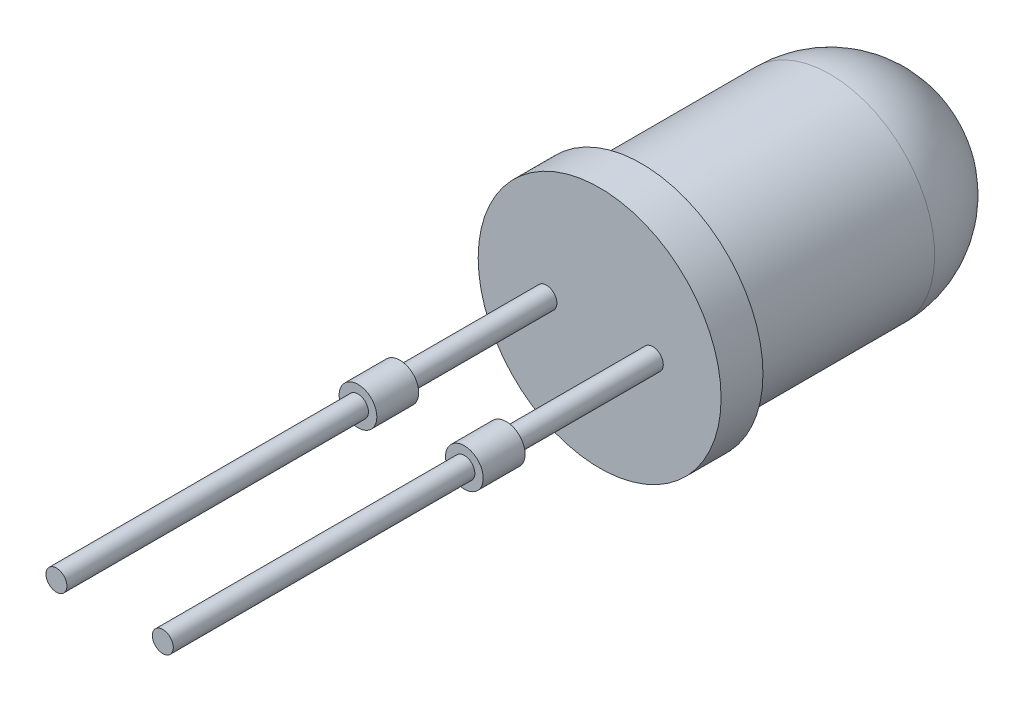
ISO-10303-21;
HEADER;
FILE_DESCRIPTION(('STEP AP214'),'2;1');
FILE_NAME('part.step','',(''),(''),'','','');
FILE_SCHEMA(('AUTOMOTIVE_DESIGN { 1 0 10303 214 1 1 1 1 }'));
ENDSEC;
DATA;
#1=APPLICATION_CONTEXT('core data for automotive mechanical design processes');
#2=APPLICATION_PROTOCOL_DEFINITION('international standard','automotive_design',2000,#1);
#3=PRODUCT_CONTEXT('',#1,'mechanical');
#4=PRODUCT('Part','Part','',(#3));
#5=PRODUCT_RELATED_PRODUCT_CATEGORY('part','',(#4));
#6=PRODUCT_DEFINITION_FORMATION('','',#4);
#7=PRODUCT_DEFINITION_CONTEXT('part definition',#1,'design');
#8=PRODUCT_DEFINITION('design','',#6,#7);
#9=PRODUCT_DEFINITION_SHAPE('','',#8);
#10=(LENGTH_UNIT() NAMED_UNIT(*) SI_UNIT(.MILLI.,.METRE.));
#11=(NAMED_UNIT(*) PLANE_ANGLE_UNIT() SI_UNIT($,.RADIAN.));
#12=(NAMED_UNIT(*) SI_UNIT($,.STERADIAN.) SOLID_ANGLE_UNIT());
#13=UNCERTAINTY_MEASURE_WITH_UNIT(LENGTH_MEASURE(1.E-05),#10,'distance_accuracy_value','');
#14=(GEOMETRIC_REPRESENTATION_CONTEXT(3) GLOBAL_UNCERTAINTY_ASSIGNED_CONTEXT((#13)) GLOBAL_UNIT_ASSIGNED_CONTEXT((#10,
#11,#12)) REPRESENTATION_CONTEXT('',''));
#15=CARTESIAN_POINT('',(0.,0.,0.));
#16=DIRECTION('',(0.,0.,1.));
#17=DIRECTION('',(1.,0.,0.));
#18=AXIS2_PLACEMENT_3D('',#15,#16,#17);
#19=CARTESIAN_POINT('',(0.,0.,5.5));
#20=DIRECTION('',(0.,0.,1.));
#21=DIRECTION('',(1.,0.,0.));
#22=AXIS2_PLACEMENT_3D('',#19,#20,#21);
#23=PLANE('',#22);
#24=CARTESIAN_POINT('',(0.,0.,5.5));
#25=DIRECTION('',(0.,0.,1.));
#26=DIRECTION('',(1.,0.,0.));
#27=AXIS2_PLACEMENT_3D('',#24,#25,#26);
#28=CIRCLE('',#27,2.9);
#29=CARTESIAN_POINT('',(2.9,0.,5.5));
#30=VERTEX_POINT('',#29);
#31=EDGE_CURVE('E51',#30,#30,#28,.T.);
#32=ORIENTED_EDGE('',*,*,#31,.T.);
#33=EDGE_LOOP('',(#32));
#34=FACE_BOUND('',#33,.T.);
#35=CARTESIAN_POINT('',(-1.27,0.,5.5));
#36=DIRECTION('',(0.,0.,1.));
#37=DIRECTION('',(1.,0.,0.));
#38=AXIS2_PLACEMENT_3D('',#35,#36,#37);
#39=CIRCLE('',#38,0.25);
#40=CARTESIAN_POINT('',(-1.02,0.,5.5));
#41=VERTEX_POINT('',#40);
#42=EDGE_CURVE('E73',#41,#41,#39,.T.);
#43=ORIENTED_EDGE('',*,*,#42,.F.);
#44=EDGE_LOOP('',(#43));
#45=FACE_BOUND('',#44,.T.);
#46=CARTESIAN_POINT('',(1.27,0.,5.5));
#47=DIRECTION('',(0.,0.,1.));
#48=DIRECTION('',(1.,0.,0.));
#49=AXIS2_PLACEMENT_3D('',#46,#47,#48);
#50=CIRCLE('',#49,0.25);
#51=CARTESIAN_POINT('',(1.52,0.,5.5));
#52=VERTEX_POINT('',#51);
#53=EDGE_CURVE('E82',#52,#52,#50,.T.);
#54=ORIENTED_EDGE('',*,*,#53,.F.);
#55=EDGE_LOOP('',(#54));
#56=FACE_BOUND('',#55,.T.);
#57=ADVANCED_FACE('F31',(#34,#45,#56),#23,.T.);
#58=CARTESIAN_POINT('',(0.,0.,5.5));
#59=DIRECTION('',(0.,0.,-1.));
#60=DIRECTION('',(-1.,0.,0.));
#61=AXIS2_PLACEMENT_3D('',#58,#59,#60);
#62=CYLINDRICAL_SURFACE('',#61,2.5);
#63=CARTESIAN_POINT('',(0.,0.,0.));
#64=DIRECTION('',(0.,0.,-1.));
#65=DIRECTION('',(-1.,0.,0.));
#66=AXIS2_PLACEMENT_3D('',#63,#64,#65);
#67=CIRCLE('',#66,2.5);
#68=CARTESIAN_POINT('',(-2.5,0.,0.));
#69=VERTEX_POINT('',#68);
#70=EDGE_CURVE('E60',#69,#69,#67,.T.);
#71=ORIENTED_EDGE('',*,*,#70,.F.);
#72=EDGE_LOOP('',(#71));
#73=FACE_BOUND('',#72,.T.);
#74=CARTESIAN_POINT('',(0.,0.,4.5));
#75=DIRECTION('',(0.,0.,1.));
#76=DIRECTION('',(1.,0.,0.));
#77=AXIS2_PLACEMENT_3D('',#74,#75,#76);
#78=CIRCLE('',#77,2.5);
#79=CARTESIAN_POINT('',(2.5,0.,4.5));
#80=VERTEX_POINT('',#79);
#81=EDGE_CURVE('E42',#80,#80,#78,.T.);
#82=ORIENTED_EDGE('',*,*,#81,.F.);
#83=EDGE_LOOP('',(#82));
#84=FACE_BOUND('',#83,.T.);
#85=ADVANCED_FACE('F33',(#73,#84),#62,.T.);
#86=CARTESIAN_POINT('',(0.,0.,4.5));
#87=DIRECTION('',(0.,0.,1.));
#88=DIRECTION('',(1.,0.,0.));
#89=AXIS2_PLACEMENT_3D('',#86,#87,#88);
#90=PLANE('',#89);
#91=CARTESIAN_POINT('',(0.,0.,4.5));
#92=DIRECTION('',(0.,0.,1.));
#93=DIRECTION('',(1.,0.,0.));
#94=AXIS2_PLACEMENT_3D('',#91,#92,#93);
#95=CIRCLE('',#94,2.9);
#96=CARTESIAN_POINT('',(2.9,0.,4.5));
#97=VERTEX_POINT('',#96);
#98=EDGE_CURVE('E46',#97,#97,#95,.T.);
#99=ORIENTED_EDGE('',*,*,#98,.F.);
#100=EDGE_LOOP('',(#99));
#101=FACE_BOUND('',#100,.T.);
#102=ORIENTED_EDGE('',*,*,#81,.T.);
#103=EDGE_LOOP('',(#102));
#104=FACE_BOUND('',#103,.T.);
#105=ADVANCED_FACE('F102',(#101,#104),#90,.F.);
#106=CARTESIAN_POINT('',(0.,0.,4.5));
#107=DIRECTION('',(0.,0.,1.));
#108=DIRECTION('',(1.,0.,0.));
#109=AXIS2_PLACEMENT_3D('',#106,#107,#108);
#110=CYLINDRICAL_SURFACE('',#109,2.9);
#111=ORIENTED_EDGE('',*,*,#98,.T.);
#112=EDGE_LOOP('',(#111));
#113=FACE_BOUND('',#112,.T.);
#114=ORIENTED_EDGE('',*,*,#31,.F.);
#115=EDGE_LOOP('',(#114));
#116=FACE_BOUND('',#115,.T.);
#117=ADVANCED_FACE('F106',(#113,#116),#110,.T.);
#118=CARTESIAN_POINT('',(0.,0.,0.));
#119=DIRECTION('',(0.,0.,-1.));
#120=DIRECTION('',(0.,1.,0.));
#121=AXIS2_PLACEMENT_3D('',#118,#119,#120);
#122=SPHERICAL_SURFACE('',#121,2.5);
#123=ORIENTED_EDGE('',*,*,#70,.T.);
#124=EDGE_LOOP('',(#123));
#125=FACE_BOUND('',#124,.T.);
#126=ADVANCED_FACE('F109',(#125),#122,.T.);
#127=CARTESIAN_POINT('',(-1.27,0.,9.));
#128=DIRECTION('',(0.,0.,1.));
#129=DIRECTION('',(1.,0.,0.));
#130=AXIS2_PLACEMENT_3D('',#127,#128,#129);
#131=PLANE('',#130);
#132=CARTESIAN_POINT('',(-1.27,0.,9.));
#133=DIRECTION('',(0.,0.,1.));
#134=DIRECTION('',(1.,0.,0.));
#135=AXIS2_PLACEMENT_3D('',#132,#133,#134);
#136=CIRCLE('',#135,0.45);
#137=CARTESIAN_POINT('',(-0.82,0.,9.));
#138=VERTEX_POINT('',#137);
#139=EDGE_CURVE('E69',#138,#138,#136,.T.);
#140=ORIENTED_EDGE('',*,*,#139,.F.);
#141=EDGE_LOOP('',(#140));
#142=FACE_BOUND('',#141,.T.);
#143=CARTESIAN_POINT('',(-1.27,0.,9.));
#144=DIRECTION('',(0.,0.,1.));
#145=DIRECTION('',(1.,0.,0.));
#146=AXIS2_PLACEMENT_3D('',#143,#144,#145);
#147=CIRCLE('',#146,0.25);
#148=CARTESIAN_POINT('',(-1.02,0.,9.));
#149=VERTEX_POINT('',#148);
#150=EDGE_CURVE('E72',#149,#149,#147,.T.);
#151=ORIENTED_EDGE('',*,*,#150,.T.);
#152=EDGE_LOOP('',(#151));
#153=FACE_BOUND('',#152,.T.);
#154=ADVANCED_FACE('F134',(#142,#153),#131,.F.);
#155=CARTESIAN_POINT('',(-1.27,0.,9.));
#156=DIRECTION('',(0.,0.,-1.));
#157=DIRECTION('',(-1.,0.,0.));
#158=AXIS2_PLACEMENT_3D('',#155,#156,#157);
#159=CYLINDRICAL_SURFACE('',#158,0.25);
#160=ORIENTED_EDGE('',*,*,#150,.F.);
#161=EDGE_LOOP('',(#160));
#162=FACE_BOUND('',#161,.T.);
#163=ORIENTED_EDGE('',*,*,#42,.T.);
#164=EDGE_LOOP('',(#163));
#165=FACE_BOUND('',#164,.T.);
#166=ADVANCED_FACE('F130',(#162,#165),#159,.T.);
#167=CARTESIAN_POINT('',(-1.27,0.,17.2));
#168=DIRECTION('',(0.,0.,1.));
#169=DIRECTION('',(1.,0.,0.));
#170=AXIS2_PLACEMENT_3D('',#167,#168,#169);
#171=PLANE('',#170);
#172=CARTESIAN_POINT('',(-1.27,0.,17.2));
#173=DIRECTION('',(0.,0.,-1.));
#174=DIRECTION('',(1.,0.,0.));
#175=AXIS2_PLACEMENT_3D('',#172,#173,#174);
#176=CIRCLE('',#175,0.25);
#177=CARTESIAN_POINT('',(-1.02,0.,17.2));
#178=VERTEX_POINT('',#177);
#179=EDGE_CURVE('E57',#178,#178,#176,.T.);
#180=ORIENTED_EDGE('',*,*,#179,.F.);
#181=EDGE_LOOP('',(#180));
#182=FACE_BOUND('',#181,.T.);
#183=ADVANCED_FACE('F126',(#182),#171,.T.);
#184=CARTESIAN_POINT('',(-1.27,0.,17.2));
#185=DIRECTION('',(0.,0.,-1.));
#186=DIRECTION('',(-1.,0.,0.));
#187=AXIS2_PLACEMENT_3D('',#184,#185,#186);
#188=CYLINDRICAL_SURFACE('',#187,0.25);
#189=CARTESIAN_POINT('',(-1.27,0.,10.));
#190=DIRECTION('',(0.,0.,1.));
#191=DIRECTION('',(1.,0.,0.));
#192=AXIS2_PLACEMENT_3D('',#189,#190,#191);
#193=CIRCLE('',#192,0.25);
#194=CARTESIAN_POINT('',(-1.02,0.,10.));
#195=VERTEX_POINT('',#194);
#196=EDGE_CURVE('E38',#195,#195,#193,.F.);
#197=ORIENTED_EDGE('',*,*,#196,.F.);
#198=EDGE_LOOP('',(#197));
#199=FACE_BOUND('',#198,.T.);
#200=ORIENTED_EDGE('',*,*,#179,.T.);
#201=EDGE_LOOP('',(#200));
#202=FACE_BOUND('',#201,.T.);
#203=ADVANCED_FACE('F122',(#199,#202),#188,.T.);
#204=CARTESIAN_POINT('',(-1.27,0.,10.));
#205=DIRECTION('',(0.,0.,1.));
#206=DIRECTION('',(1.,0.,0.));
#207=AXIS2_PLACEMENT_3D('',#204,#205,#206);
#208=PLANE('',#207);
#209=CARTESIAN_POINT('',(-1.27,0.,10.));
#210=DIRECTION('',(0.,0.,1.));
#211=DIRECTION('',(1.,0.,0.));
#212=AXIS2_PLACEMENT_3D('',#209,#210,#211);
#213=CIRCLE('',#212,0.45);
#214=CARTESIAN_POINT('',(-0.82,0.,10.));
#215=VERTEX_POINT('',#214);
#216=EDGE_CURVE('E63',#215,#215,#213,.T.);
#217=ORIENTED_EDGE('',*,*,#216,.T.);
#218=EDGE_LOOP('',(#217));
#219=FACE_BOUND('',#218,.T.);
#220=ORIENTED_EDGE('',*,*,#196,.T.);
#221=EDGE_LOOP('',(#220));
#222=FACE_BOUND('',#221,.T.);
#223=ADVANCED_FACE('F125',(#219,#222),#208,.T.);
#224=CARTESIAN_POINT('',(-1.27,0.,10.));
#225=DIRECTION('',(0.,0.,-1.));
#226=DIRECTION('',(-1.,0.,0.));
#227=AXIS2_PLACEMENT_3D('',#224,#225,#226);
#228=CYLINDRICAL_SURFACE('',#227,0.45);
#229=ORIENTED_EDGE('',*,*,#139,.T.);
#230=EDGE_LOOP('',(#229));
#231=FACE_BOUND('',#230,.T.);
#232=ORIENTED_EDGE('',*,*,#216,.F.);
#233=EDGE_LOOP('',(#232));
#234=FACE_BOUND('',#233,.T.);
#235=ADVANCED_FACE('F136',(#231,#234),#228,.T.);
#236=CARTESIAN_POINT('',(1.27,0.,9.));
#237=DIRECTION('',(0.,0.,1.));
#238=DIRECTION('',(1.,0.,0.));
#239=AXIS2_PLACEMENT_3D('',#236,#237,#238);
#240=PLANE('',#239);
#241=CARTESIAN_POINT('',(1.27,0.,9.));
#242=DIRECTION('',(0.,0.,1.));
#243=DIRECTION('',(1.,0.,0.));
#244=AXIS2_PLACEMENT_3D('',#241,#242,#243);
#245=CIRCLE('',#244,0.45);
#246=CARTESIAN_POINT('',(1.72,0.,9.));
#247=VERTEX_POINT('',#246);
#248=EDGE_CURVE('E76',#247,#247,#245,.T.);
#249=ORIENTED_EDGE('',*,*,#248,.F.);
#250=EDGE_LOOP('',(#249));
#251=FACE_BOUND('',#250,.T.);
#252=CARTESIAN_POINT('',(1.27,0.,9.));
#253=DIRECTION('',(0.,0.,1.));
#254=DIRECTION('',(1.,0.,0.));
#255=AXIS2_PLACEMENT_3D('',#252,#253,#254);
#256=CIRCLE('',#255,0.25);
#257=CARTESIAN_POINT('',(1.52,0.,9.));
#258=VERTEX_POINT('',#257);
#259=EDGE_CURVE('E81',#258,#258,#256,.T.);
#260=ORIENTED_EDGE('',*,*,#259,.T.);
#261=EDGE_LOOP('',(#260));
#262=FACE_BOUND('',#261,.T.);
#263=ADVANCED_FACE('F88',(#251,#262),#240,.F.);
#264=CARTESIAN_POINT('',(1.27,0.,9.));
#265=DIRECTION('',(0.,0.,-1.));
#266=DIRECTION('',(-1.,0.,0.));
#267=AXIS2_PLACEMENT_3D('',#264,#265,#266);
#268=CYLINDRICAL_SURFACE('',#267,0.25);
#269=ORIENTED_EDGE('',*,*,#259,.F.);
#270=EDGE_LOOP('',(#269));
#271=FACE_BOUND('',#270,.T.);
#272=ORIENTED_EDGE('',*,*,#53,.T.);
#273=EDGE_LOOP('',(#272));
#274=FACE_BOUND('',#273,.T.);
#275=ADVANCED_FACE('F90',(#271,#274),#268,.T.);
#276=CARTESIAN_POINT('',(1.27,0.,17.2));
#277=DIRECTION('',(0.,0.,-1.));
#278=DIRECTION('',(-1.,0.,0.));
#279=AXIS2_PLACEMENT_3D('',#276,#277,#278);
#280=PLANE('',#279);
#281=CARTESIAN_POINT('',(1.27,0.,17.2));
#282=DIRECTION('',(0.,0.,-1.));
#283=DIRECTION('',(-1.,0.,0.));
#284=AXIS2_PLACEMENT_3D('',#281,#282,#283);
#285=CIRCLE('',#284,0.25);
#286=CARTESIAN_POINT('',(1.02,0.,17.2));
#287=VERTEX_POINT('',#286);
#288=EDGE_CURVE('E54',#287,#287,#285,.T.);
#289=ORIENTED_EDGE('',*,*,#288,.F.);
#290=EDGE_LOOP('',(#289));
#291=FACE_BOUND('',#290,.T.);
#292=ADVANCED_FACE('F93',(#291),#280,.F.);
#293=CARTESIAN_POINT('',(1.27,0.,17.2));
#294=DIRECTION('',(0.,0.,-1.));
#295=DIRECTION('',(-1.,0.,0.));
#296=AXIS2_PLACEMENT_3D('',#293,#294,#295);
#297=CYLINDRICAL_SURFACE('',#296,0.25);
#298=CARTESIAN_POINT('',(1.27,0.,10.));
#299=DIRECTION('',(0.,0.,1.));
#300=DIRECTION('',(1.,0.,0.));
#301=AXIS2_PLACEMENT_3D('',#298,#299,#300);
#302=CIRCLE('',#301,0.25);
#303=CARTESIAN_POINT('',(1.52,0.,10.));
#304=VERTEX_POINT('',#303);
#305=EDGE_CURVE('E10',#304,#304,#302,.F.);
#306=ORIENTED_EDGE('',*,*,#305,.F.);
#307=EDGE_LOOP('',(#306));
#308=FACE_BOUND('',#307,.T.);
#309=ORIENTED_EDGE('',*,*,#288,.T.);
#310=EDGE_LOOP('',(#309));
#311=FACE_BOUND('',#310,.T.);
#312=ADVANCED_FACE('F114',(#308,#311),#297,.T.);
#313=CARTESIAN_POINT('',(1.27,0.,10.));
#314=DIRECTION('',(0.,0.,1.));
#315=DIRECTION('',(1.,0.,0.));
#316=AXIS2_PLACEMENT_3D('',#313,#314,#315);
#317=PLANE('',#316);
#318=CARTESIAN_POINT('',(1.27,0.,10.));
#319=DIRECTION('',(0.,0.,1.));
#320=DIRECTION('',(1.,0.,0.));
#321=AXIS2_PLACEMENT_3D('',#318,#319,#320);
#322=CIRCLE('',#321,0.45);
#323=CARTESIAN_POINT('',(1.72,0.,10.));
#324=VERTEX_POINT('',#323);
#325=EDGE_CURVE('E66',#324,#324,#322,.T.);
#326=ORIENTED_EDGE('',*,*,#325,.T.);
#327=EDGE_LOOP('',(#326));
#328=FACE_BOUND('',#327,.T.);
#329=ORIENTED_EDGE('',*,*,#305,.T.);
#330=EDGE_LOOP('',(#329));
#331=FACE_BOUND('',#330,.T.);
#332=ADVANCED_FACE('F117',(#328,#331),#317,.T.);
#333=CARTESIAN_POINT('',(1.27,0.,10.));
#334=DIRECTION('',(0.,0.,-1.));
#335=DIRECTION('',(-1.,0.,0.));
#336=AXIS2_PLACEMENT_3D('',#333,#334,#335);
#337=CYLINDRICAL_SURFACE('',#336,0.45);
#338=ORIENTED_EDGE('',*,*,#248,.T.);
#339=EDGE_LOOP('',(#338));
#340=FACE_BOUND('',#339,.T.);
#341=ORIENTED_EDGE('',*,*,#325,.F.);
#342=EDGE_LOOP('',(#341));
#343=FACE_BOUND('',#342,.T.);
#344=ADVANCED_FACE('F143',(#340,#343),#337,.T.);
#345=CLOSED_SHELL('',(#57,#85,#105,#117,#126,#154,#166,#183,#203,#223,#235,#263,#275,#292,#312,
#332,#344));
#346=MANIFOLD_SOLID_BREP('B2',#345);
#347=ADVANCED_BREP_SHAPE_REPRESENTATION('',(#18,#346),#14);
#348=SHAPE_DEFINITION_REPRESENTATION(#9,#347);
ENDSEC;
END-ISO-10303-21;
